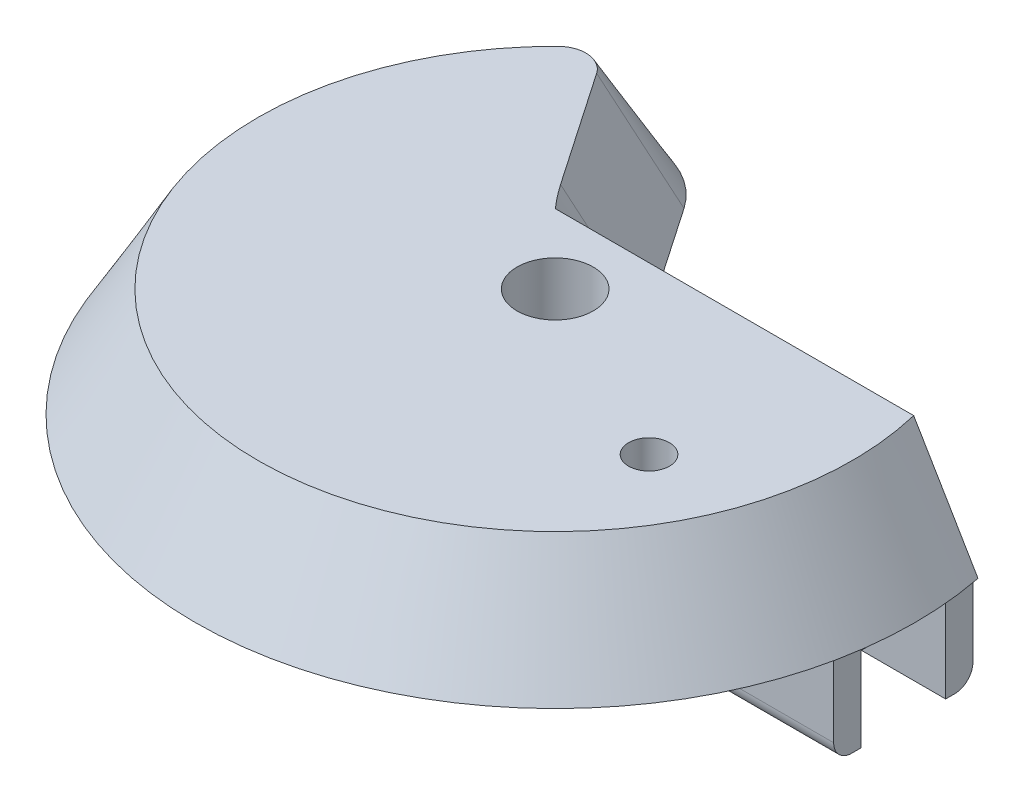
ISO-10303-21;
HEADER;
FILE_DESCRIPTION(('STEP AP214'),'2;1');
FILE_NAME('part.step','',(''),(''),'','','');
FILE_SCHEMA(('AUTOMOTIVE_DESIGN { 1 0 10303 214 1 1 1 1 }'));
ENDSEC;
DATA;
#1=APPLICATION_CONTEXT('core data for automotive mechanical design processes');
#2=APPLICATION_PROTOCOL_DEFINITION('international standard','automotive_design',2000,#1);
#3=PRODUCT_CONTEXT('',#1,'mechanical');
#4=PRODUCT('Part','Part','',(#3));
#5=PRODUCT_RELATED_PRODUCT_CATEGORY('part','',(#4));
#6=PRODUCT_DEFINITION_FORMATION('','',#4);
#7=PRODUCT_DEFINITION_CONTEXT('part definition',#1,'design');
#8=PRODUCT_DEFINITION('design','',#6,#7);
#9=PRODUCT_DEFINITION_SHAPE('','',#8);
#10=(LENGTH_UNIT() NAMED_UNIT(*) SI_UNIT(.MILLI.,.METRE.));
#11=(NAMED_UNIT(*) PLANE_ANGLE_UNIT() SI_UNIT($,.RADIAN.));
#12=(NAMED_UNIT(*) SI_UNIT($,.STERADIAN.) SOLID_ANGLE_UNIT());
#13=UNCERTAINTY_MEASURE_WITH_UNIT(LENGTH_MEASURE(1.E-05),#10,'distance_accuracy_value','');
#14=(GEOMETRIC_REPRESENTATION_CONTEXT(3) GLOBAL_UNCERTAINTY_ASSIGNED_CONTEXT((#13)) GLOBAL_UNIT_ASSIGNED_CONTEXT((#10,
#11,#12)) REPRESENTATION_CONTEXT('',''));
#15=CARTESIAN_POINT('',(0.,0.,0.));
#16=DIRECTION('',(0.,0.,1.));
#17=DIRECTION('',(1.,0.,0.));
#18=AXIS2_PLACEMENT_3D('',#15,#16,#17);
#19=CARTESIAN_POINT('',(0.,-12.,0.));
#20=DIRECTION('',(0.,1.,0.));
#21=DIRECTION('',(0.,0.,1.));
#22=AXIS2_PLACEMENT_3D('',#19,#20,#21);
#23=PLANE('',#22);
#24=CARTESIAN_POINT('',(20.9735256274257,-12.,10.6231172563582));
#25=DIRECTION('',(0.,1.,0.));
#26=DIRECTION('',(0.,0.,1.));
#27=AXIS2_PLACEMENT_3D('',#24,#25,#26);
#28=CIRCLE('',#27,2.25);
#29=CARTESIAN_POINT('',(20.9735256274257,-12.,12.8731172563582));
#30=VERTEX_POINT('',#29);
#31=EDGE_CURVE('E279',#30,#30,#28,.T.);
#32=ORIENTED_EDGE('',*,*,#31,.T.);
#33=EDGE_LOOP('',(#32));
#34=FACE_BOUND('',#33,.T.);
#35=CARTESIAN_POINT('',(0.,-12.,0.));
#36=DIRECTION('',(0.,1.,0.));
#37=DIRECTION('',(0.,0.,1.));
#38=AXIS2_PLACEMENT_3D('',#35,#36,#37);
#39=CIRCLE('',#38,8.4);
#40=CARTESIAN_POINT('',(3.71139905376892,-12.,-7.53561656824995));
#41=VERTEX_POINT('',#40);
#42=EDGE_CURVE('E282',#41,#41,#39,.T.);
#43=ORIENTED_EDGE('',*,*,#42,.T.);
#44=EDGE_LOOP('',(#43));
#45=FACE_BOUND('',#44,.T.);
#46=DIRECTION('',(1.,0.,0.));
#47=VECTOR('',#46,1.);
#48=CARTESIAN_POINT('',(0.,-12.,-7.675));
#49=LINE('',#48,#47);
#50=CARTESIAN_POINT('',(3.43385314886016,-12.,-7.675));
#51=VERTEX_POINT('',#50);
#52=CARTESIAN_POINT('',(17.7686097581926,-12.,-7.675));
#53=VERTEX_POINT('',#52);
#54=EDGE_CURVE('E269',#51,#53,#49,.T.);
#55=ORIENTED_EDGE('',*,*,#54,.T.);
#56=DIRECTION('',(0.,0.,1.));
#57=VECTOR('',#56,1.);
#58=CARTESIAN_POINT('',(17.7686097581926,-12.,0.));
#59=LINE('',#58,#57);
#60=CARTESIAN_POINT('',(17.7686097581926,-12.,7.675));
#61=VERTEX_POINT('',#60);
#62=EDGE_CURVE('E296',#53,#61,#59,.T.);
#63=ORIENTED_EDGE('',*,*,#62,.T.);
#64=DIRECTION('',(1.,0.,0.));
#65=VECTOR('',#64,1.);
#66=CARTESIAN_POINT('',(0.,-12.,7.675));
#67=LINE('',#66,#65);
#68=CARTESIAN_POINT('',(38.3811776341245,-12.,7.675));
#69=VERTEX_POINT('',#68);
#70=EDGE_CURVE('E231',#61,#69,#67,.T.);
#71=ORIENTED_EDGE('',*,*,#70,.T.);
#72=DIRECTION('',(0.,0.,1.));
#73=VECTOR('',#72,1.);
#74=CARTESIAN_POINT('',(38.3811776341245,-12.,0.));
#75=LINE('',#74,#73);
#76=CARTESIAN_POINT('',(38.3811776341245,-12.,-7.675));
#77=VERTEX_POINT('',#76);
#78=EDGE_CURVE('E293',#77,#69,#75,.T.);
#79=ORIENTED_EDGE('',*,*,#78,.F.);
#80=CARTESIAN_POINT('',(38.9450824201449,-12.,-7.675));
#81=VERTEX_POINT('',#80);
#82=EDGE_CURVE('E273',#77,#81,#49,.T.);
#83=ORIENTED_EDGE('',*,*,#82,.T.);
#84=CARTESIAN_POINT('',(0.,-12.,0.));
#85=DIRECTION('',(0.,1.,0.));
#86=DIRECTION('',(0.,0.,1.));
#87=AXIS2_PLACEMENT_3D('',#84,#85,#86);
#88=CIRCLE('',#87,39.6941440229145);
#89=CARTESIAN_POINT('',(-27.8617472863134,-12.,-28.272744965169));
#90=VERTEX_POINT('',#89);
#91=EDGE_CURVE('E276',#90,#81,#88,.T.);
#92=ORIENTED_EDGE('',*,*,#91,.F.);
#93=CARTESIAN_POINT('',(-20.842639563464,-12.,-21.1500961057182));
#94=DIRECTION('',(0.,1.,0.));
#95=DIRECTION('',(0.,0.,1.));
#96=AXIS2_PLACEMENT_3D('',#93,#94,#95);
#97=CIRCLE('',#96,10.);
#98=CARTESIAN_POINT('',(-12.5900248475404,-12.,-26.7976044368782));
#99=VERTEX_POINT('',#98);
#100=EDGE_CURVE('E299',#90,#99,#97,.F.);
#101=ORIENTED_EDGE('',*,*,#100,.T.);
#102=DIRECTION('',(-0.564750833116,0.,-0.825261471592357));
#103=VECTOR('',#102,1.);
#104=CARTESIAN_POINT('',(3.91496367041069,-12.,-2.67912542944382));
#105=LINE('',#104,#103);
#106=CARTESIAN_POINT('',(-3.95716596434268,-12.,-14.1825441160489));
#107=VERTEX_POINT('',#106);
#108=EDGE_CURVE('E272',#107,#99,#105,.T.);
#109=ORIENTED_EDGE('',*,*,#108,.F.);
#110=CARTESIAN_POINT('',(12.5480634675045,-12.,-25.4775607783689));
#111=DIRECTION('',(0.,1.,0.));
#112=DIRECTION('',(0.,0.,1.));
#113=AXIS2_PLACEMENT_3D('',#110,#111,#112);
#114=CIRCLE('',#113,20.);
#115=EDGE_CURVE('E304',#107,#51,#114,.T.);
#116=ORIENTED_EDGE('',*,*,#115,.T.);
#117=EDGE_LOOP('',(#55,#63,#71,#79,#83,#92,#101,#109,#116));
#118=FACE_BOUND('',#117,.T.);
#119=ADVANCED_FACE('F97',(#34,#45,#118),#23,.F.);
#120=CARTESIAN_POINT('',(20.9735256274257,-12.,10.6231172563582));
#121=DIRECTION('',(0.,1.,0.));
#122=DIRECTION('',(0.,0.,1.));
#123=AXIS2_PLACEMENT_3D('',#120,#121,#122);
#124=CYLINDRICAL_SURFACE('',#123,2.25);
#125=ORIENTED_EDGE('',*,*,#31,.F.);
#126=EDGE_LOOP('',(#125));
#127=FACE_BOUND('',#126,.T.);
#128=CARTESIAN_POINT('',(20.9735256274257,0.,10.6231172563582));
#129=DIRECTION('',(0.,1.,0.));
#130=DIRECTION('',(0.,0.,1.));
#131=AXIS2_PLACEMENT_3D('',#128,#129,#130);
#132=CIRCLE('',#131,2.25);
#133=CARTESIAN_POINT('',(20.9735256274257,0.,12.8731172563582));
#134=VERTEX_POINT('',#133);
#135=EDGE_CURVE('E286',#134,#134,#132,.T.);
#136=ORIENTED_EDGE('',*,*,#135,.T.);
#137=EDGE_LOOP('',(#136));
#138=FACE_BOUND('',#137,.T.);
#139=ADVANCED_FACE('F337',(#127,#138),#124,.F.);
#140=CARTESIAN_POINT('',(0.,-12.,-7.675));
#141=DIRECTION('',(0.,0.,1.));
#142=DIRECTION('',(1.,0.,0.));
#143=AXIS2_PLACEMENT_3D('',#140,#141,#142);
#144=PLANE('',#143);
#145=DIRECTION('',(0.,1.,0.));
#146=VECTOR('',#145,1.);
#147=CARTESIAN_POINT('',(38.3811776341245,-22.3,-7.675));
#148=LINE('',#147,#146);
#149=CARTESIAN_POINT('',(38.3811776341245,-20.3,-7.675));
#150=VERTEX_POINT('',#149);
#151=EDGE_CURVE('E244',#150,#77,#148,.T.);
#152=ORIENTED_EDGE('',*,*,#151,.F.);
#153=DIRECTION('',(1.,0.,0.));
#154=VECTOR('',#153,1.);
#155=CARTESIAN_POINT('',(0.,-20.3,-7.675));
#156=LINE('',#155,#154);
#157=CARTESIAN_POINT('',(17.7686097581926,-20.3,-7.675));
#158=VERTEX_POINT('',#157);
#159=EDGE_CURVE('E617',#150,#158,#156,.F.);
#160=ORIENTED_EDGE('',*,*,#159,.T.);
#161=DIRECTION('',(0.,1.,0.));
#162=VECTOR('',#161,1.);
#163=CARTESIAN_POINT('',(17.7686097581926,-22.3,-7.675));
#164=LINE('',#163,#162);
#165=EDGE_CURVE('E251',#158,#53,#164,.T.);
#166=ORIENTED_EDGE('',*,*,#165,.T.);
#167=ORIENTED_EDGE('',*,*,#54,.F.);
#168=CARTESIAN_POINT('',(3.43385314886016,-12.0000000000001,-7.675));
#169=CARTESIAN_POINT('',(3.16509977102612,-11.7878199173388,-7.675));
#170=CARTESIAN_POINT('',(2.8999491605244,-11.5711473041912,-7.675));
#171=CARTESIAN_POINT('',(2.376291456584,-11.1300255224403,-7.675));
#172=CARTESIAN_POINT('',(2.11778287741517,-10.905578119796,-7.675));
#173=CARTESIAN_POINT('',(1.60696948967239,-10.4502350734224,-7.675));
#174=CARTESIAN_POINT('',(1.35465901507849,-10.2193457649966,-7.675));
#175=CARTESIAN_POINT('',(0.855425904831999,-9.75179511947812,-7.675));
#176=CARTESIAN_POINT('',(0.608503615925011,-9.51513341297805,-7.675));
#177=CARTESIAN_POINT('',(-0.123303412390303,-8.79926794266473,-7.675));
#178=CARTESIAN_POINT('',(-0.600938297715339,-8.31264221638727,-7.675));
#179=CARTESIAN_POINT('',(-1.54027260397968,-7.32409556800103,-7.675));
#180=CARTESIAN_POINT('',(-2.00196750928276,-6.82217038631456,-7.675));
#181=CARTESIAN_POINT('',(-2.91114937083853,-5.80728486737952,-7.675));
#182=CARTESIAN_POINT('',(-3.35866059058954,-5.29434620931261,-7.675));
#183=CARTESIAN_POINT('',(-4.24243008109922,-4.2589684343839,-7.675));
#184=CARTESIAN_POINT('',(-4.67868929249936,-3.73653011793755,-7.675));
#185=CARTESIAN_POINT('',(-5.54314551304943,-2.68210767982905,-7.675));
#186=CARTESIAN_POINT('',(-5.97131061377276,-2.15009744051064,-7.675));
#187=CARTESIAN_POINT('',(-6.6074050999024,-1.34723799540016,-7.675));
#188=CARTESIAN_POINT('',(-6.81840788067204,-1.07881498420958,-7.675));
#189=CARTESIAN_POINT('',(-7.23850718271114,-0.540486962151467,-7.675));
#190=CARTESIAN_POINT('',(-7.44760372989138,-0.270581971508098,-7.675));
#191=CARTESIAN_POINT('',(-7.6558212813131,0.,-7.675));
#192=B_SPLINE_CURVE_WITH_KNOTS('',3,(#168,#169,#170,#171,#172,#173,#174,#175,#176,#177,#178,
#179,#180,#181,#182,#183,#184,#185,#186,#187,#188,#189,#190,#191),.UNSPECIFIED.,.F.,.F.,(4,2,2,
2,2,2,2,2,2,2,2,4),(0.,1.02713587755836,2.05403996278495,3.07996745691712,4.10596077895177,
6.15104621953882,8.19670633622943,10.2386540698866,12.2804305445612,14.3290477380538,
15.3533249348555,16.3775881881932),.UNSPECIFIED.);
#193=CARTESIAN_POINT('',(-7.6558212813131,0.,-7.675));
#194=VERTEX_POINT('',#193);
#195=EDGE_CURVE('E322',#51,#194,#192,.T.);
#196=ORIENTED_EDGE('',*,*,#195,.T.);
#197=DIRECTION('',(1.,0.,0.));
#198=VECTOR('',#197,1.);
#199=CARTESIAN_POINT('',(0.,0.,-7.675));
#200=LINE('',#199,#198);
#201=CARTESIAN_POINT('',(31.8543756967034,0.,-7.675));
#202=VERTEX_POINT('',#201);
#203=EDGE_CURVE('E283',#194,#202,#200,.T.);
#204=ORIENTED_EDGE('',*,*,#203,.T.);
#205=CARTESIAN_POINT('',(31.8543756967034,0.,-7.675));
#206=CARTESIAN_POINT('',(32.4474666063347,-0.998699476136833,-7.675));
#207=CARTESIAN_POINT('',(33.0398988028588,-1.99778984438652,-7.675));
#208=CARTESIAN_POINT('',(34.2236143543739,-3.99664962429959,-7.675));
#209=CARTESIAN_POINT('',(34.8148977105041,-4.99641903528836,-7.675));
#210=CARTESIAN_POINT('',(35.996485187201,-6.99653587976873,-7.675));
#211=CARTESIAN_POINT('',(36.5867893080243,-7.99688331310883,-7.675));
#212=CARTESIAN_POINT('',(37.7665444684636,-9.99808245106307,-7.675));
#213=CARTESIAN_POINT('',(38.3559955072343,-10.9989341561756,-7.675));
#214=CARTESIAN_POINT('',(38.9450824201449,-12.0000000000001,-7.675));
#215=B_SPLINE_CURVE_WITH_KNOTS('',3,(#205,#206,#207,#208,#209,#210,#211,#212,#213,#214),
.UNSPECIFIED.,.F.,.F.,(4,2,2,2,4),(0.,3.48459652622498,6.9691895955894,10.4537817520332,
13.9383773591094),.UNSPECIFIED.);
#216=EDGE_CURVE('E315',#202,#81,#215,.T.);
#217=ORIENTED_EDGE('',*,*,#216,.T.);
#218=ORIENTED_EDGE('',*,*,#82,.F.);
#219=EDGE_LOOP('',(#152,#160,#166,#167,#196,#204,#217,#218));
#220=FACE_BOUND('',#219,.T.);
#221=ADVANCED_FACE('F331',(#220),#144,.F.);
#222=CARTESIAN_POINT('',(0.,0.,0.));
#223=DIRECTION('',(0.,1.,0.));
#224=DIRECTION('',(0.,0.,1.));
#225=AXIS2_PLACEMENT_3D('',#222,#223,#224);
#226=PLANE('',#225);
#227=ORIENTED_EDGE('',*,*,#203,.F.);
#228=CARTESIAN_POINT('',(12.5480634675045,0.,-25.4775607783689));
#229=DIRECTION('',(0.,1.,0.));
#230=DIRECTION('',(0.,0.,1.));
#231=AXIS2_PLACEMENT_3D('',#228,#229,#230);
#232=CIRCLE('',#231,26.9282032302755);
#233=CARTESIAN_POINT('',(-9.67474515765077,0.,-10.2698355697538));
#234=VERTEX_POINT('',#233);
#235=EDGE_CURVE('E312',#194,#234,#232,.F.);
#236=ORIENTED_EDGE('',*,*,#235,.T.);
#237=DIRECTION('',(-0.564750833116,0.,-0.825261471592357));
#238=VECTOR('',#237,1.);
#239=CARTESIAN_POINT('',(-1.8026155228974,0.,1.23358311685124));
#240=LINE('',#239,#238);
#241=CARTESIAN_POINT('',(-18.3076040408485,0.,-22.8848958905831));
#242=VERTEX_POINT('',#241);
#243=EDGE_CURVE('E310',#234,#242,#240,.T.);
#244=ORIENTED_EDGE('',*,*,#243,.T.);
#245=CARTESIAN_POINT('',(-20.842639563464,0.,-21.1500961057182));
#246=DIRECTION('',(0.,1.,0.));
#247=DIRECTION('',(0.,0.,1.));
#248=AXIS2_PLACEMENT_3D('',#245,#246,#247);
#249=CIRCLE('',#248,3.07179676972449);
#250=CARTESIAN_POINT('',(-22.9987668064037,0.,-23.3380290815525));
#251=VERTEX_POINT('',#250);
#252=EDGE_CURVE('E308',#242,#251,#249,.T.);
#253=ORIENTED_EDGE('',*,*,#252,.T.);
#254=CARTESIAN_POINT('',(0.,0.,0.));
#255=DIRECTION('',(0.,1.,0.));
#256=DIRECTION('',(0.,0.,1.));
#257=AXIS2_PLACEMENT_3D('',#254,#255,#256);
#258=CIRCLE('',#257,32.765940792639);
#259=EDGE_CURVE('E306',#251,#202,#258,.T.);
#260=ORIENTED_EDGE('',*,*,#259,.T.);
#261=EDGE_LOOP('',(#227,#236,#244,#253,#260));
#262=FACE_BOUND('',#261,.T.);
#263=ORIENTED_EDGE('',*,*,#135,.F.);
#264=EDGE_LOOP('',(#263));
#265=FACE_BOUND('',#264,.T.);
#266=CARTESIAN_POINT('',(0.,0.,0.));
#267=DIRECTION('',(0.,1.,0.));
#268=DIRECTION('',(0.,0.,1.));
#269=AXIS2_PLACEMENT_3D('',#266,#267,#268);
#270=CIRCLE('',#269,4.2);
#271=CARTESIAN_POINT('',(0.,0.,4.2));
#272=VERTEX_POINT('',#271);
#273=EDGE_CURVE('E268',#272,#272,#270,.T.);
#274=ORIENTED_EDGE('',*,*,#273,.F.);
#275=EDGE_LOOP('',(#274));
#276=FACE_BOUND('',#275,.T.);
#277=ADVANCED_FACE('F336',(#262,#265,#276),#226,.T.);
#278=CARTESIAN_POINT('',(0.,-12.,0.));
#279=DIRECTION('',(0.,1.,0.));
#280=DIRECTION('',(0.,0.,1.));
#281=AXIS2_PLACEMENT_3D('',#278,#279,#280);
#282=CYLINDRICAL_SURFACE('',#281,8.4);
#283=ORIENTED_EDGE('',*,*,#42,.F.);
#284=EDGE_LOOP('',(#283));
#285=FACE_BOUND('',#284,.T.);
#286=CARTESIAN_POINT('',(0.,-13.,0.));
#287=DIRECTION('',(0.,1.,0.));
#288=DIRECTION('',(0.,0.,1.));
#289=AXIS2_PLACEMENT_3D('',#286,#287,#288);
#290=CIRCLE('',#289,8.4);
#291=CARTESIAN_POINT('',(0.,-13.,8.4));
#292=VERTEX_POINT('',#291);
#293=EDGE_CURVE('E262',#292,#292,#290,.T.);
#294=ORIENTED_EDGE('',*,*,#293,.T.);
#295=EDGE_LOOP('',(#294));
#296=FACE_BOUND('',#295,.T.);
#297=ADVANCED_FACE('F345',(#285,#296),#282,.T.);
#298=CARTESIAN_POINT('',(0.,-12.,0.));
#299=DIRECTION('',(0.,1.,0.));
#300=DIRECTION('',(0.,0.,1.));
#301=AXIS2_PLACEMENT_3D('',#298,#299,#300);
#302=CYLINDRICAL_SURFACE('',#301,4.2);
#303=ORIENTED_EDGE('',*,*,#273,.T.);
#304=EDGE_LOOP('',(#303));
#305=FACE_BOUND('',#304,.T.);
#306=CARTESIAN_POINT('',(0.,-13.,0.));
#307=DIRECTION('',(0.,1.,0.));
#308=DIRECTION('',(0.,0.,1.));
#309=AXIS2_PLACEMENT_3D('',#306,#307,#308);
#310=CIRCLE('',#309,4.2);
#311=CARTESIAN_POINT('',(0.,-13.,4.2));
#312=VERTEX_POINT('',#311);
#313=EDGE_CURVE('E265',#312,#312,#310,.T.);
#314=ORIENTED_EDGE('',*,*,#313,.F.);
#315=EDGE_LOOP('',(#314));
#316=FACE_BOUND('',#315,.T.);
#317=ADVANCED_FACE('F340',(#305,#316),#302,.F.);
#318=CARTESIAN_POINT('',(0.,-13.,0.));
#319=DIRECTION('',(0.,1.,0.));
#320=DIRECTION('',(0.,0.,1.));
#321=AXIS2_PLACEMENT_3D('',#318,#319,#320);
#322=PLANE('',#321);
#323=ORIENTED_EDGE('',*,*,#293,.F.);
#324=EDGE_LOOP('',(#323));
#325=FACE_BOUND('',#324,.T.);
#326=ORIENTED_EDGE('',*,*,#313,.T.);
#327=EDGE_LOOP('',(#326));
#328=FACE_BOUND('',#327,.T.);
#329=ADVANCED_FACE('F344',(#325,#328),#322,.F.);
#330=CARTESIAN_POINT('',(17.7686097581926,-13.,0.));
#331=DIRECTION('',(-1.,0.,0.));
#332=DIRECTION('',(0.,0.,1.));
#333=AXIS2_PLACEMENT_3D('',#330,#331,#332);
#334=PLANE('',#333);
#335=DIRECTION('',(0.,0.,1.));
#336=VECTOR('',#335,1.);
#337=CARTESIAN_POINT('',(17.7686097581926,-22.3,0.));
#338=LINE('',#337,#336);
#339=CARTESIAN_POINT('',(17.7686097581926,-22.3,4.675));
#340=VERTEX_POINT('',#339);
#341=CARTESIAN_POINT('',(17.7686097581926,-22.3,5.675));
#342=VERTEX_POINT('',#341);
#343=EDGE_CURVE('E209',#340,#342,#338,.T.);
#344=ORIENTED_EDGE('',*,*,#343,.T.);
#345=CARTESIAN_POINT('',(17.7686097581926,-20.3,5.675));
#346=DIRECTION('',(-1.,0.,0.));
#347=DIRECTION('',(0.,0.,1.));
#348=AXIS2_PLACEMENT_3D('',#345,#346,#347);
#349=CIRCLE('',#348,2.);
#350=CARTESIAN_POINT('',(17.7686097581926,-20.3,7.675));
#351=VERTEX_POINT('',#350);
#352=EDGE_CURVE('E12',#342,#351,#349,.T.);
#353=ORIENTED_EDGE('',*,*,#352,.T.);
#354=DIRECTION('',(0.,1.,0.));
#355=VECTOR('',#354,1.);
#356=CARTESIAN_POINT('',(17.7686097581926,-22.3,7.675));
#357=LINE('',#356,#355);
#358=EDGE_CURVE('E232',#351,#61,#357,.T.);
#359=ORIENTED_EDGE('',*,*,#358,.T.);
#360=ORIENTED_EDGE('',*,*,#62,.F.);
#361=ORIENTED_EDGE('',*,*,#165,.F.);
#362=CARTESIAN_POINT('',(17.7686097581926,-20.3,-5.675));
#363=DIRECTION('',(-1.,0.,0.));
#364=DIRECTION('',(0.,0.,1.));
#365=AXIS2_PLACEMENT_3D('',#362,#363,#364);
#366=CIRCLE('',#365,2.);
#367=CARTESIAN_POINT('',(17.7686097581926,-22.3,-5.675));
#368=VERTEX_POINT('',#367);
#369=EDGE_CURVE('E613',#158,#368,#366,.T.);
#370=ORIENTED_EDGE('',*,*,#369,.T.);
#371=DIRECTION('',(0.,0.,1.));
#372=VECTOR('',#371,1.);
#373=CARTESIAN_POINT('',(17.7686097581926,-22.3,0.));
#374=LINE('',#373,#372);
#375=CARTESIAN_POINT('',(17.7686097581926,-22.3,-4.675));
#376=VERTEX_POINT('',#375);
#377=EDGE_CURVE('E239',#368,#376,#374,.T.);
#378=ORIENTED_EDGE('',*,*,#377,.T.);
#379=DIRECTION('',(0.,1.,0.));
#380=VECTOR('',#379,1.);
#381=CARTESIAN_POINT('',(17.7686097581926,-22.3,-4.675));
#382=LINE('',#381,#380);
#383=CARTESIAN_POINT('',(17.7686097581926,-13.,-4.675));
#384=VERTEX_POINT('',#383);
#385=EDGE_CURVE('E248',#376,#384,#382,.T.);
#386=ORIENTED_EDGE('',*,*,#385,.T.);
#387=DIRECTION('',(0.,0.,1.));
#388=VECTOR('',#387,1.);
#389=CARTESIAN_POINT('',(17.7686097581926,-13.,0.));
#390=LINE('',#389,#388);
#391=CARTESIAN_POINT('',(17.7686097581926,-13.,4.675));
#392=VERTEX_POINT('',#391);
#393=EDGE_CURVE('E247',#384,#392,#390,.T.);
#394=ORIENTED_EDGE('',*,*,#393,.T.);
#395=DIRECTION('',(0.,1.,0.));
#396=VECTOR('',#395,1.);
#397=CARTESIAN_POINT('',(17.7686097581926,-22.3,4.675));
#398=LINE('',#397,#396);
#399=EDGE_CURVE('E219',#340,#392,#398,.T.);
#400=ORIENTED_EDGE('',*,*,#399,.F.);
#401=EDGE_LOOP('',(#344,#353,#359,#360,#361,#370,#378,#386,#394,#400));
#402=FACE_BOUND('',#401,.T.);
#403=ADVANCED_FACE('F388',(#402),#334,.T.);
#404=CARTESIAN_POINT('',(38.3811776341245,-13.,0.));
#405=DIRECTION('',(-1.,0.,0.));
#406=DIRECTION('',(0.,0.,1.));
#407=AXIS2_PLACEMENT_3D('',#404,#405,#406);
#408=PLANE('',#407);
#409=DIRECTION('',(0.,1.,0.));
#410=VECTOR('',#409,1.);
#411=CARTESIAN_POINT('',(38.3811776341245,-22.3,7.675));
#412=LINE('',#411,#410);
#413=CARTESIAN_POINT('',(38.3811776341245,-20.3,7.675));
#414=VERTEX_POINT('',#413);
#415=EDGE_CURVE('E229',#414,#69,#412,.T.);
#416=ORIENTED_EDGE('',*,*,#415,.F.);
#417=CARTESIAN_POINT('',(38.3811776341245,-20.3,5.675));
#418=DIRECTION('',(-1.,0.,0.));
#419=DIRECTION('',(0.,0.,1.));
#420=AXIS2_PLACEMENT_3D('',#417,#418,#419);
#421=CIRCLE('',#420,2.);
#422=CARTESIAN_POINT('',(38.3811776341245,-22.3,5.675));
#423=VERTEX_POINT('',#422);
#424=EDGE_CURVE('E119',#414,#423,#421,.F.);
#425=ORIENTED_EDGE('',*,*,#424,.T.);
#426=DIRECTION('',(0.,0.,1.));
#427=VECTOR('',#426,1.);
#428=CARTESIAN_POINT('',(38.3811776341245,-22.3,0.));
#429=LINE('',#428,#427);
#430=CARTESIAN_POINT('',(38.3811776341245,-22.3,4.675));
#431=VERTEX_POINT('',#430);
#432=EDGE_CURVE('E208',#431,#423,#429,.T.);
#433=ORIENTED_EDGE('',*,*,#432,.F.);
#434=DIRECTION('',(0.,1.,0.));
#435=VECTOR('',#434,1.);
#436=CARTESIAN_POINT('',(38.3811776341245,-22.3,4.675));
#437=LINE('',#436,#435);
#438=CARTESIAN_POINT('',(38.3811776341245,-13.,4.675));
#439=VERTEX_POINT('',#438);
#440=EDGE_CURVE('E215',#431,#439,#437,.T.);
#441=ORIENTED_EDGE('',*,*,#440,.T.);
#442=DIRECTION('',(0.,0.,1.));
#443=VECTOR('',#442,1.);
#444=CARTESIAN_POINT('',(38.3811776341245,-13.,0.));
#445=LINE('',#444,#443);
#446=CARTESIAN_POINT('',(38.3811776341245,-13.,-4.675));
#447=VERTEX_POINT('',#446);
#448=EDGE_CURVE('E257',#447,#439,#445,.T.);
#449=ORIENTED_EDGE('',*,*,#448,.F.);
#450=DIRECTION('',(0.,1.,0.));
#451=VECTOR('',#450,1.);
#452=CARTESIAN_POINT('',(38.3811776341245,-22.3,-4.675));
#453=LINE('',#452,#451);
#454=CARTESIAN_POINT('',(38.3811776341245,-22.3,-4.675));
#455=VERTEX_POINT('',#454);
#456=EDGE_CURVE('E245',#455,#447,#453,.T.);
#457=ORIENTED_EDGE('',*,*,#456,.F.);
#458=DIRECTION('',(0.,0.,1.));
#459=VECTOR('',#458,1.);
#460=CARTESIAN_POINT('',(38.3811776341245,-22.3,0.));
#461=LINE('',#460,#459);
#462=CARTESIAN_POINT('',(38.3811776341245,-22.3,-5.675));
#463=VERTEX_POINT('',#462);
#464=EDGE_CURVE('E237',#463,#455,#461,.T.);
#465=ORIENTED_EDGE('',*,*,#464,.F.);
#466=CARTESIAN_POINT('',(38.3811776341245,-20.3,-5.675));
#467=DIRECTION('',(-1.,0.,0.));
#468=DIRECTION('',(0.,0.,1.));
#469=AXIS2_PLACEMENT_3D('',#466,#467,#468);
#470=CIRCLE('',#469,2.);
#471=EDGE_CURVE('E622',#463,#150,#470,.F.);
#472=ORIENTED_EDGE('',*,*,#471,.T.);
#473=ORIENTED_EDGE('',*,*,#151,.T.);
#474=ORIENTED_EDGE('',*,*,#78,.T.);
#475=EDGE_LOOP('',(#416,#425,#433,#441,#449,#457,#465,#472,#473,#474));
#476=FACE_BOUND('',#475,.T.);
#477=ADVANCED_FACE('F221',(#476),#408,.F.);
#478=CARTESIAN_POINT('',(0.,-13.,0.));
#479=DIRECTION('',(0.,1.,0.));
#480=DIRECTION('',(0.,0.,1.));
#481=AXIS2_PLACEMENT_3D('',#478,#479,#480);
#482=PLANE('',#481);
#483=ORIENTED_EDGE('',*,*,#393,.F.);
#484=DIRECTION('',(1.,0.,0.));
#485=VECTOR('',#484,1.);
#486=CARTESIAN_POINT('',(0.,-13.,-4.675));
#487=LINE('',#486,#485);
#488=EDGE_CURVE('E259',#384,#447,#487,.T.);
#489=ORIENTED_EDGE('',*,*,#488,.T.);
#490=ORIENTED_EDGE('',*,*,#448,.T.);
#491=DIRECTION('',(1.,0.,0.));
#492=VECTOR('',#491,1.);
#493=CARTESIAN_POINT('',(0.,-13.,4.675));
#494=LINE('',#493,#492);
#495=EDGE_CURVE('E217',#392,#439,#494,.T.);
#496=ORIENTED_EDGE('',*,*,#495,.F.);
#497=EDGE_LOOP('',(#483,#489,#490,#496));
#498=FACE_BOUND('',#497,.T.);
#499=ADVANCED_FACE('F399',(#498),#482,.F.);
#500=CARTESIAN_POINT('',(0.,-22.3,-4.675));
#501=DIRECTION('',(0.,0.,1.));
#502=DIRECTION('',(1.,0.,0.));
#503=AXIS2_PLACEMENT_3D('',#500,#501,#502);
#504=PLANE('',#503);
#505=ORIENTED_EDGE('',*,*,#488,.F.);
#506=ORIENTED_EDGE('',*,*,#385,.F.);
#507=DIRECTION('',(1.,0.,0.));
#508=VECTOR('',#507,1.);
#509=CARTESIAN_POINT('',(0.,-22.3,-4.675));
#510=LINE('',#509,#508);
#511=EDGE_CURVE('E241',#376,#455,#510,.T.);
#512=ORIENTED_EDGE('',*,*,#511,.T.);
#513=ORIENTED_EDGE('',*,*,#456,.T.);
#514=EDGE_LOOP('',(#505,#506,#512,#513));
#515=FACE_BOUND('',#514,.T.);
#516=ADVANCED_FACE('F404',(#515),#504,.T.);
#517=CARTESIAN_POINT('',(0.,-22.3,0.));
#518=DIRECTION('',(0.,1.,0.));
#519=DIRECTION('',(0.,0.,1.));
#520=AXIS2_PLACEMENT_3D('',#517,#518,#519);
#521=PLANE('',#520);
#522=ORIENTED_EDGE('',*,*,#377,.F.);
#523=DIRECTION('',(1.,0.,0.));
#524=VECTOR('',#523,1.);
#525=CARTESIAN_POINT('',(0.,-22.3,-5.675));
#526=LINE('',#525,#524);
#527=EDGE_CURVE('E619',#368,#463,#526,.T.);
#528=ORIENTED_EDGE('',*,*,#527,.T.);
#529=ORIENTED_EDGE('',*,*,#464,.T.);
#530=ORIENTED_EDGE('',*,*,#511,.F.);
#531=EDGE_LOOP('',(#522,#528,#529,#530));
#532=FACE_BOUND('',#531,.T.);
#533=ADVANCED_FACE('F408',(#532),#521,.F.);
#534=CARTESIAN_POINT('',(0.,-22.3,7.675));
#535=DIRECTION('',(0.,0.,1.));
#536=DIRECTION('',(1.,0.,0.));
#537=AXIS2_PLACEMENT_3D('',#534,#535,#536);
#538=PLANE('',#537);
#539=ORIENTED_EDGE('',*,*,#358,.F.);
#540=DIRECTION('',(1.,0.,0.));
#541=VECTOR('',#540,1.);
#542=CARTESIAN_POINT('',(38.3811776341245,-20.3,7.675));
#543=LINE('',#542,#541);
#544=EDGE_CURVE('E603',#351,#414,#543,.T.);
#545=ORIENTED_EDGE('',*,*,#544,.T.);
#546=ORIENTED_EDGE('',*,*,#415,.T.);
#547=ORIENTED_EDGE('',*,*,#70,.F.);
#548=EDGE_LOOP('',(#539,#545,#546,#547));
#549=FACE_BOUND('',#548,.T.);
#550=ADVANCED_FACE('F412',(#549),#538,.T.);
#551=CARTESIAN_POINT('',(0.,-22.3,4.675));
#552=DIRECTION('',(0.,0.,1.));
#553=DIRECTION('',(1.,0.,0.));
#554=AXIS2_PLACEMENT_3D('',#551,#552,#553);
#555=PLANE('',#554);
#556=ORIENTED_EDGE('',*,*,#399,.T.);
#557=ORIENTED_EDGE('',*,*,#495,.T.);
#558=ORIENTED_EDGE('',*,*,#440,.F.);
#559=DIRECTION('',(1.,0.,0.));
#560=VECTOR('',#559,1.);
#561=CARTESIAN_POINT('',(0.,-22.3,4.675));
#562=LINE('',#561,#560);
#563=EDGE_CURVE('E205',#340,#431,#562,.T.);
#564=ORIENTED_EDGE('',*,*,#563,.F.);
#565=EDGE_LOOP('',(#556,#557,#558,#564));
#566=FACE_BOUND('',#565,.T.);
#567=ADVANCED_FACE('F216',(#566),#555,.F.);
#568=CARTESIAN_POINT('',(0.,-22.3,0.));
#569=DIRECTION('',(0.,1.,0.));
#570=DIRECTION('',(0.,0.,1.));
#571=AXIS2_PLACEMENT_3D('',#568,#569,#570);
#572=PLANE('',#571);
#573=ORIENTED_EDGE('',*,*,#432,.T.);
#574=DIRECTION('',(1.,0.,0.));
#575=VECTOR('',#574,1.);
#576=CARTESIAN_POINT('',(17.7686097581926,-22.3,5.675));
#577=LINE('',#576,#575);
#578=EDGE_CURVE('E105',#423,#342,#577,.F.);
#579=ORIENTED_EDGE('',*,*,#578,.T.);
#580=ORIENTED_EDGE('',*,*,#343,.F.);
#581=ORIENTED_EDGE('',*,*,#563,.T.);
#582=EDGE_LOOP('',(#573,#579,#580,#581));
#583=FACE_BOUND('',#582,.T.);
#584=ADVANCED_FACE('F207',(#583),#572,.F.);
#585=CARTESIAN_POINT('',(0.,0.,0.));
#586=DIRECTION('',(0.,-1.,0.));
#587=DIRECTION('',(0.,0.,-1.));
#588=AXIS2_PLACEMENT_3D('',#585,#586,#587);
#589=CONICAL_SURFACE('',#588,32.765940792639,0.523598775598296);
#590=ORIENTED_EDGE('',*,*,#216,.F.);
#591=ORIENTED_EDGE('',*,*,#259,.F.);
#592=DIRECTION('',(0.350955386142466,0.86602540378444,0.356132442972542));
#593=VECTOR('',#592,1.);
#594=CARTESIAN_POINT('',(-27.8617472863134,-12.0000000000001,-28.272744965169));
#595=LINE('',#594,#593);
#596=EDGE_CURVE('E222',#90,#251,#595,.T.);
#597=ORIENTED_EDGE('',*,*,#596,.F.);
#598=ORIENTED_EDGE('',*,*,#91,.T.);
#599=EDGE_LOOP('',(#590,#591,#597,#598));
#600=FACE_BOUND('',#599,.T.);
#601=ADVANCED_FACE('F328',(#600),#589,.T.);
#602=CARTESIAN_POINT('',(-20.842639563464,0.,-21.1500961057182));
#603=DIRECTION('',(0.,-1.,0.));
#604=DIRECTION('',(0.,0.,-1.));
#605=AXIS2_PLACEMENT_3D('',#602,#603,#604);
#606=CONICAL_SURFACE('',#605,3.07179676972449,0.523598775598296);
#607=ORIENTED_EDGE('',*,*,#596,.T.);
#608=ORIENTED_EDGE('',*,*,#252,.F.);
#609=DIRECTION('',(-0.412630735796177,0.86602540378444,0.282375416557999));
#610=VECTOR('',#609,1.);
#611=CARTESIAN_POINT('',(-12.5900248475404,-12.0000000000001,-26.7976044368782));
#612=LINE('',#611,#610);
#613=EDGE_CURVE('E225',#99,#242,#612,.T.);
#614=ORIENTED_EDGE('',*,*,#613,.F.);
#615=ORIENTED_EDGE('',*,*,#100,.F.);
#616=EDGE_LOOP('',(#607,#608,#614,#615));
#617=FACE_BOUND('',#616,.T.);
#618=ADVANCED_FACE('F357',(#617),#606,.T.);
#619=CARTESIAN_POINT('',(-1.8026155228974,0.,1.23358311685124));
#620=DIRECTION('',(-0.714697399163513,-0.499999999999998,0.489088568286883));
#621=DIRECTION('',(-0.564750833116,0.,-0.825261471592358));
#622=AXIS2_PLACEMENT_3D('',#619,#620,#621);
#623=PLANE('',#622);
#624=ORIENTED_EDGE('',*,*,#613,.T.);
#625=ORIENTED_EDGE('',*,*,#243,.F.);
#626=DIRECTION('',(-0.412630735796177,0.86602540378444,0.282375416557999));
#627=VECTOR('',#626,1.);
#628=CARTESIAN_POINT('',(-3.95716596434268,-12.0000000000001,-14.1825441160489));
#629=LINE('',#628,#627);
#630=EDGE_CURVE('E629',#107,#234,#629,.T.);
#631=ORIENTED_EDGE('',*,*,#630,.F.);
#632=ORIENTED_EDGE('',*,*,#108,.T.);
#633=EDGE_LOOP('',(#624,#625,#631,#632));
#634=FACE_BOUND('',#633,.T.);
#635=ADVANCED_FACE('F354',(#634),#623,.F.);
#636=CARTESIAN_POINT('',(12.5480634675045,0.,-25.4775607783689));
#637=DIRECTION('',(0.,1.,0.));
#638=DIRECTION('',(0.,0.,1.));
#639=AXIS2_PLACEMENT_3D('',#636,#637,#638);
#640=CONICAL_SURFACE('',#639,26.9282032302755,0.523598775598296);
#641=ORIENTED_EDGE('',*,*,#195,.F.);
#642=ORIENTED_EDGE('',*,*,#115,.F.);
#643=ORIENTED_EDGE('',*,*,#630,.T.);
#644=ORIENTED_EDGE('',*,*,#235,.F.);
#645=EDGE_LOOP('',(#641,#642,#643,#644));
#646=FACE_BOUND('',#645,.T.);
#647=ADVANCED_FACE('F349',(#646),#640,.F.);
#648=CARTESIAN_POINT('',(0.,-20.3,-5.675));
#649=DIRECTION('',(1.,0.,0.));
#650=DIRECTION('',(0.,0.,-1.));
#651=AXIS2_PLACEMENT_3D('',#648,#649,#650);
#652=CYLINDRICAL_SURFACE('',#651,2.);
#653=ORIENTED_EDGE('',*,*,#369,.F.);
#654=ORIENTED_EDGE('',*,*,#159,.F.);
#655=ORIENTED_EDGE('',*,*,#471,.F.);
#656=ORIENTED_EDGE('',*,*,#527,.F.);
#657=EDGE_LOOP('',(#653,#654,#655,#656));
#658=FACE_BOUND('',#657,.T.);
#659=ADVANCED_FACE('F353',(#658),#652,.T.);
#660=CARTESIAN_POINT('',(0.,-20.3,5.675));
#661=DIRECTION('',(-1.,0.,0.));
#662=DIRECTION('',(0.,0.,1.));
#663=AXIS2_PLACEMENT_3D('',#660,#661,#662);
#664=CYLINDRICAL_SURFACE('',#663,2.);
#665=ORIENTED_EDGE('',*,*,#352,.F.);
#666=ORIENTED_EDGE('',*,*,#578,.F.);
#667=ORIENTED_EDGE('',*,*,#424,.F.);
#668=ORIENTED_EDGE('',*,*,#544,.F.);
#669=EDGE_LOOP('',(#665,#666,#667,#668));
#670=FACE_BOUND('',#669,.T.);
#671=ADVANCED_FACE('F99',(#670),#664,.T.);
#672=CLOSED_SHELL('',(#119,#139,#221,#277,#297,#317,#329,#403,#477,#499,#516,#533,#550,#567,
#584,#601,#618,#635,#647,#659,#671));
#673=MANIFOLD_SOLID_BREP('B2',#672);
#674=ADVANCED_BREP_SHAPE_REPRESENTATION('',(#18,#673),#14);
#675=SHAPE_DEFINITION_REPRESENTATION(#9,#674);
ENDSEC;
END-ISO-10303-21;
